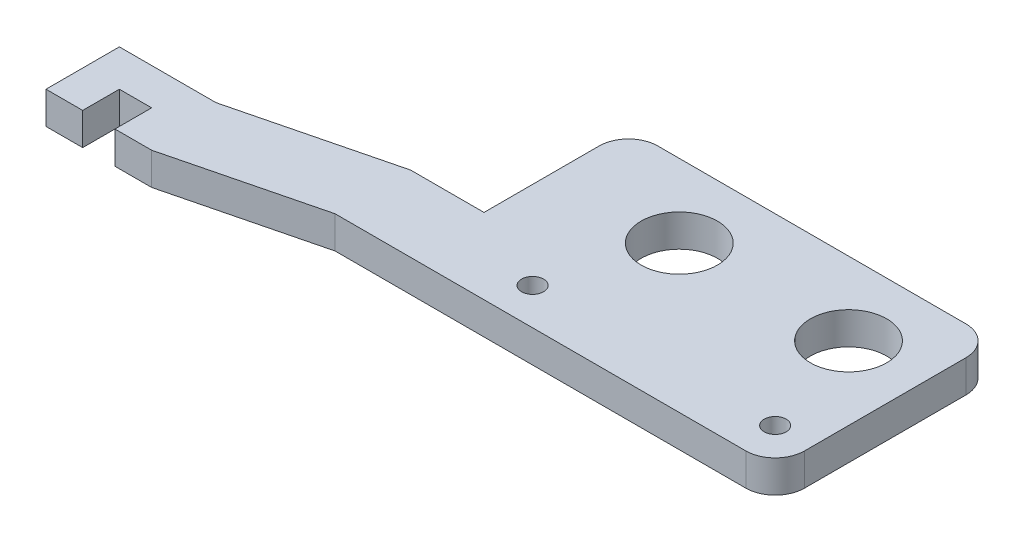
ISO-10303-21;
HEADER;
FILE_DESCRIPTION(('STEP AP214'),'2;1');
FILE_NAME('part.step','',(''),(''),'','','');
FILE_SCHEMA(('AUTOMOTIVE_DESIGN { 1 0 10303 214 1 1 1 1 }'));
ENDSEC;
DATA;
#1=APPLICATION_CONTEXT('core data for automotive mechanical design processes');
#2=APPLICATION_PROTOCOL_DEFINITION('international standard','automotive_design',2000,#1);
#3=PRODUCT_CONTEXT('',#1,'mechanical');
#4=PRODUCT('Part','Part','',(#3));
#5=PRODUCT_RELATED_PRODUCT_CATEGORY('part','',(#4));
#6=PRODUCT_DEFINITION_FORMATION('','',#4);
#7=PRODUCT_DEFINITION_CONTEXT('part definition',#1,'design');
#8=PRODUCT_DEFINITION('design','',#6,#7);
#9=PRODUCT_DEFINITION_SHAPE('','',#8);
#10=(LENGTH_UNIT() NAMED_UNIT(*) SI_UNIT(.MILLI.,.METRE.));
#11=(NAMED_UNIT(*) PLANE_ANGLE_UNIT() SI_UNIT($,.RADIAN.));
#12=(NAMED_UNIT(*) SI_UNIT($,.STERADIAN.) SOLID_ANGLE_UNIT());
#13=UNCERTAINTY_MEASURE_WITH_UNIT(LENGTH_MEASURE(1.E-05),#10,'distance_accuracy_value','');
#14=(GEOMETRIC_REPRESENTATION_CONTEXT(3) GLOBAL_UNCERTAINTY_ASSIGNED_CONTEXT((#13)) GLOBAL_UNIT_ASSIGNED_CONTEXT((#10,
#11,#12)) REPRESENTATION_CONTEXT('',''));
#15=CARTESIAN_POINT('',(0.,0.,0.));
#16=DIRECTION('',(0.,0.,1.));
#17=DIRECTION('',(1.,0.,0.));
#18=AXIS2_PLACEMENT_3D('',#15,#16,#17);
#19=CARTESIAN_POINT('',(59.944,2.794,-19.05));
#20=DIRECTION('',(-1.,0.,0.));
#21=DIRECTION('',(0.,0.,1.));
#22=AXIS2_PLACEMENT_3D('',#19,#20,#21);
#23=PLANE('',#22);
#24=DIRECTION('',(0.,0.,-1.));
#25=VECTOR('',#24,1.);
#26=CARTESIAN_POINT('',(59.944,0.,-19.05));
#27=LINE('',#26,#25);
#28=CARTESIAN_POINT('',(59.944,0.,-2.54000000000001));
#29=VERTEX_POINT('',#28);
#30=CARTESIAN_POINT('',(59.944,0.,-16.51));
#31=VERTEX_POINT('',#30);
#32=EDGE_CURVE('E238',#29,#31,#27,.T.);
#33=ORIENTED_EDGE('',*,*,#32,.T.);
#34=DIRECTION('',(0.,-1.,0.));
#35=VECTOR('',#34,1.);
#36=CARTESIAN_POINT('',(59.944,2.794,-16.51));
#37=LINE('',#36,#35);
#38=CARTESIAN_POINT('',(59.944,2.794,-16.51));
#39=VERTEX_POINT('',#38);
#40=EDGE_CURVE('E48',#31,#39,#37,.F.);
#41=ORIENTED_EDGE('',*,*,#40,.T.);
#42=DIRECTION('',(0.,0.,-1.));
#43=VECTOR('',#42,1.);
#44=CARTESIAN_POINT('',(59.944,2.794,-19.05));
#45=LINE('',#44,#43);
#46=CARTESIAN_POINT('',(59.944,2.794,-2.54000000000001));
#47=VERTEX_POINT('',#46);
#48=EDGE_CURVE('E268',#47,#39,#45,.T.);
#49=ORIENTED_EDGE('',*,*,#48,.F.);
#50=DIRECTION('',(0.,-1.,0.));
#51=VECTOR('',#50,1.);
#52=CARTESIAN_POINT('',(59.944,2.794,-2.54));
#53=LINE('',#52,#51);
#54=EDGE_CURVE('E315',#47,#29,#53,.T.);
#55=ORIENTED_EDGE('',*,*,#54,.T.);
#56=EDGE_LOOP('',(#33,#41,#49,#55));
#57=FACE_BOUND('',#56,.T.);
#58=ADVANCED_FACE('F39',(#57),#23,.F.);
#59=CARTESIAN_POINT('',(28.194,2.794,-19.05));
#60=DIRECTION('',(0.,0.,1.));
#61=DIRECTION('',(1.,0.,0.));
#62=AXIS2_PLACEMENT_3D('',#59,#60,#61);
#63=PLANE('',#62);
#64=DIRECTION('',(-1.,0.,0.));
#65=VECTOR('',#64,1.);
#66=CARTESIAN_POINT('',(28.194,0.,-19.05));
#67=LINE('',#66,#65);
#68=CARTESIAN_POINT('',(57.404,0.,-19.05));
#69=VERTEX_POINT('',#68);
#70=CARTESIAN_POINT('',(30.734,0.,-19.05));
#71=VERTEX_POINT('',#70);
#72=EDGE_CURVE('E240',#69,#71,#67,.T.);
#73=ORIENTED_EDGE('',*,*,#72,.T.);
#74=DIRECTION('',(0.,-1.,0.));
#75=VECTOR('',#74,1.);
#76=CARTESIAN_POINT('',(30.734,2.794,-19.05));
#77=LINE('',#76,#75);
#78=CARTESIAN_POINT('',(30.734,2.794,-19.05));
#79=VERTEX_POINT('',#78);
#80=EDGE_CURVE('E307',#71,#79,#77,.F.);
#81=ORIENTED_EDGE('',*,*,#80,.T.);
#82=DIRECTION('',(-1.,0.,0.));
#83=VECTOR('',#82,1.);
#84=CARTESIAN_POINT('',(28.194,2.794,-19.05));
#85=LINE('',#84,#83);
#86=CARTESIAN_POINT('',(57.404,2.794,-19.05));
#87=VERTEX_POINT('',#86);
#88=EDGE_CURVE('E174',#87,#79,#85,.T.);
#89=ORIENTED_EDGE('',*,*,#88,.F.);
#90=DIRECTION('',(0.,-1.,0.));
#91=VECTOR('',#90,1.);
#92=CARTESIAN_POINT('',(57.404,2.794,-19.05));
#93=LINE('',#92,#91);
#94=EDGE_CURVE('E304',#87,#69,#93,.T.);
#95=ORIENTED_EDGE('',*,*,#94,.T.);
#96=EDGE_LOOP('',(#73,#81,#89,#95));
#97=FACE_BOUND('',#96,.T.);
#98=ADVANCED_FACE('F333',(#97),#63,.F.);
#99=CARTESIAN_POINT('',(28.194,2.794,-6.54543018066803));
#100=DIRECTION('',(1.,0.,0.));
#101=DIRECTION('',(0.,0.,-1.));
#102=AXIS2_PLACEMENT_3D('',#99,#100,#101);
#103=PLANE('',#102);
#104=DIRECTION('',(0.,0.,1.));
#105=VECTOR('',#104,1.);
#106=CARTESIAN_POINT('',(28.194,2.794,-6.54543018066803));
#107=LINE('',#106,#105);
#108=CARTESIAN_POINT('',(28.194,2.794,-16.51));
#109=VERTEX_POINT('',#108);
#110=CARTESIAN_POINT('',(28.194,2.794,-6.54543018066803));
#111=VERTEX_POINT('',#110);
#112=EDGE_CURVE('E162',#109,#111,#107,.T.);
#113=ORIENTED_EDGE('',*,*,#112,.F.);
#114=DIRECTION('',(0.,-1.,0.));
#115=VECTOR('',#114,1.);
#116=CARTESIAN_POINT('',(28.194,2.794,-16.51));
#117=LINE('',#116,#115);
#118=CARTESIAN_POINT('',(28.194,0.,-16.51));
#119=VERTEX_POINT('',#118);
#120=EDGE_CURVE('E183',#109,#119,#117,.T.);
#121=ORIENTED_EDGE('',*,*,#120,.T.);
#122=DIRECTION('',(0.,0.,1.));
#123=VECTOR('',#122,1.);
#124=CARTESIAN_POINT('',(28.194,0.,-6.54543018066803));
#125=LINE('',#124,#123);
#126=CARTESIAN_POINT('',(28.194,0.,-6.54543018066803));
#127=VERTEX_POINT('',#126);
#128=EDGE_CURVE('E180',#119,#127,#125,.T.);
#129=ORIENTED_EDGE('',*,*,#128,.T.);
#130=DIRECTION('',(0.,-1.,0.));
#131=VECTOR('',#130,1.);
#132=CARTESIAN_POINT('',(28.194,2.794,-6.54543018066803));
#133=LINE('',#132,#131);
#134=EDGE_CURVE('E177',#111,#127,#133,.T.);
#135=ORIENTED_EDGE('',*,*,#134,.F.);
#136=EDGE_LOOP('',(#113,#121,#129,#135));
#137=FACE_BOUND('',#136,.T.);
#138=ADVANCED_FACE('F178',(#137),#103,.F.);
#139=CARTESIAN_POINT('',(21.844,2.794,-6.54543018066803));
#140=DIRECTION('',(0.,0.,1.));
#141=DIRECTION('',(1.,0.,0.));
#142=AXIS2_PLACEMENT_3D('',#139,#140,#141);
#143=PLANE('',#142);
#144=DIRECTION('',(-1.,0.,0.));
#145=VECTOR('',#144,1.);
#146=CARTESIAN_POINT('',(21.844,0.,-6.54543018066803));
#147=LINE('',#146,#145);
#148=CARTESIAN_POINT('',(21.844,0.,-6.54543018066803));
#149=VERTEX_POINT('',#148);
#150=EDGE_CURVE('E245',#127,#149,#147,.T.);
#151=ORIENTED_EDGE('',*,*,#150,.T.);
#152=DIRECTION('',(0.,-1.,0.));
#153=VECTOR('',#152,1.);
#154=CARTESIAN_POINT('',(21.844,2.794,-6.54543018066803));
#155=LINE('',#154,#153);
#156=CARTESIAN_POINT('',(21.844,2.794,-6.54543018066803));
#157=VERTEX_POINT('',#156);
#158=EDGE_CURVE('E184',#157,#149,#155,.T.);
#159=ORIENTED_EDGE('',*,*,#158,.F.);
#160=DIRECTION('',(-1.,0.,0.));
#161=VECTOR('',#160,1.);
#162=CARTESIAN_POINT('',(21.844,2.794,-6.54543018066803));
#163=LINE('',#162,#161);
#164=EDGE_CURVE('E167',#111,#157,#163,.T.);
#165=ORIENTED_EDGE('',*,*,#164,.F.);
#166=ORIENTED_EDGE('',*,*,#134,.T.);
#167=EDGE_LOOP('',(#151,#159,#165,#166));
#168=FACE_BOUND('',#167,.T.);
#169=ADVANCED_FACE('F186',(#168),#143,.F.);
#170=CARTESIAN_POINT('',(8.36227927732785,2.794,-3.175));
#171=DIRECTION('',(0.242535625036333,0.,0.970142500145332));
#172=DIRECTION('',(0.970142500145332,0.,-0.242535625036333));
#173=AXIS2_PLACEMENT_3D('',#170,#171,#172);
#174=PLANE('',#173);
#175=DIRECTION('',(-0.970142500145332,0.,0.242535625036333));
#176=VECTOR('',#175,1.);
#177=CARTESIAN_POINT('',(8.36227927732785,0.,-3.175));
#178=LINE('',#177,#176);
#179=CARTESIAN_POINT('',(8.36227927732785,0.,-3.175));
#180=VERTEX_POINT('',#179);
#181=EDGE_CURVE('E247',#149,#180,#178,.T.);
#182=ORIENTED_EDGE('',*,*,#181,.T.);
#183=DIRECTION('',(0.,-1.,0.));
#184=VECTOR('',#183,1.);
#185=CARTESIAN_POINT('',(8.36227927732785,2.794,-3.175));
#186=LINE('',#185,#184);
#187=CARTESIAN_POINT('',(8.36227927732785,2.794,-3.175));
#188=VERTEX_POINT('',#187);
#189=EDGE_CURVE('E292',#188,#180,#186,.T.);
#190=ORIENTED_EDGE('',*,*,#189,.F.);
#191=DIRECTION('',(-0.970142500145332,0.,0.242535625036333));
#192=VECTOR('',#191,1.);
#193=CARTESIAN_POINT('',(8.36227927732785,2.794,-3.175));
#194=LINE('',#193,#192);
#195=EDGE_CURVE('E189',#157,#188,#194,.T.);
#196=ORIENTED_EDGE('',*,*,#195,.F.);
#197=ORIENTED_EDGE('',*,*,#158,.T.);
#198=EDGE_LOOP('',(#182,#190,#196,#197));
#199=FACE_BOUND('',#198,.T.);
#200=ADVANCED_FACE('F463',(#199),#174,.F.);
#201=CARTESIAN_POINT('',(0.,2.794,-3.175));
#202=DIRECTION('',(0.,0.,1.));
#203=DIRECTION('',(1.,0.,0.));
#204=AXIS2_PLACEMENT_3D('',#201,#202,#203);
#205=PLANE('',#204);
#206=DIRECTION('',(-1.,0.,0.));
#207=VECTOR('',#206,1.);
#208=CARTESIAN_POINT('',(0.,0.,-3.175));
#209=LINE('',#208,#207);
#210=CARTESIAN_POINT('',(0.,0.,-3.175));
#211=VERTEX_POINT('',#210);
#212=EDGE_CURVE('E249',#180,#211,#209,.T.);
#213=ORIENTED_EDGE('',*,*,#212,.T.);
#214=DIRECTION('',(0.,-1.,0.));
#215=VECTOR('',#214,1.);
#216=CARTESIAN_POINT('',(0.,2.794,-3.175));
#217=LINE('',#216,#215);
#218=CARTESIAN_POINT('',(0.,2.794,-3.175));
#219=VERTEX_POINT('',#218);
#220=EDGE_CURVE('E289',#219,#211,#217,.T.);
#221=ORIENTED_EDGE('',*,*,#220,.F.);
#222=DIRECTION('',(-1.,0.,0.));
#223=VECTOR('',#222,1.);
#224=CARTESIAN_POINT('',(0.,2.794,-3.175));
#225=LINE('',#224,#223);
#226=EDGE_CURVE('E191',#188,#219,#225,.T.);
#227=ORIENTED_EDGE('',*,*,#226,.F.);
#228=ORIENTED_EDGE('',*,*,#189,.T.);
#229=EDGE_LOOP('',(#213,#221,#227,#228));
#230=FACE_BOUND('',#229,.T.);
#231=ADVANCED_FACE('F460',(#230),#205,.F.);
#232=CARTESIAN_POINT('',(0.,2.794,3.175));
#233=DIRECTION('',(1.,0.,0.));
#234=DIRECTION('',(0.,0.,-1.));
#235=AXIS2_PLACEMENT_3D('',#232,#233,#234);
#236=PLANE('',#235);
#237=DIRECTION('',(0.,0.,1.));
#238=VECTOR('',#237,1.);
#239=CARTESIAN_POINT('',(0.,0.,3.175));
#240=LINE('',#239,#238);
#241=CARTESIAN_POINT('',(0.,0.,3.175));
#242=VERTEX_POINT('',#241);
#243=EDGE_CURVE('E251',#211,#242,#240,.T.);
#244=ORIENTED_EDGE('',*,*,#243,.T.);
#245=DIRECTION('',(0.,-1.,0.));
#246=VECTOR('',#245,1.);
#247=CARTESIAN_POINT('',(0.,2.794,3.175));
#248=LINE('',#247,#246);
#249=CARTESIAN_POINT('',(0.,2.794,3.175));
#250=VERTEX_POINT('',#249);
#251=EDGE_CURVE('E286',#250,#242,#248,.T.);
#252=ORIENTED_EDGE('',*,*,#251,.F.);
#253=DIRECTION('',(0.,0.,1.));
#254=VECTOR('',#253,1.);
#255=CARTESIAN_POINT('',(0.,2.794,3.175));
#256=LINE('',#255,#254);
#257=EDGE_CURVE('E207',#219,#250,#256,.T.);
#258=ORIENTED_EDGE('',*,*,#257,.F.);
#259=ORIENTED_EDGE('',*,*,#220,.T.);
#260=EDGE_LOOP('',(#244,#252,#258,#259));
#261=FACE_BOUND('',#260,.T.);
#262=ADVANCED_FACE('F455',(#261),#236,.F.);
#263=CARTESIAN_POINT('',(3.175,2.794,3.175));
#264=DIRECTION('',(0.,0.,-1.));
#265=DIRECTION('',(-1.,0.,0.));
#266=AXIS2_PLACEMENT_3D('',#263,#264,#265);
#267=PLANE('',#266);
#268=DIRECTION('',(1.,0.,0.));
#269=VECTOR('',#268,1.);
#270=CARTESIAN_POINT('',(3.175,0.,3.175));
#271=LINE('',#270,#269);
#272=CARTESIAN_POINT('',(3.175,0.,3.175));
#273=VERTEX_POINT('',#272);
#274=EDGE_CURVE('E253',#242,#273,#271,.T.);
#275=ORIENTED_EDGE('',*,*,#274,.T.);
#276=DIRECTION('',(0.,-1.,0.));
#277=VECTOR('',#276,1.);
#278=CARTESIAN_POINT('',(3.175,2.794,3.175));
#279=LINE('',#278,#277);
#280=CARTESIAN_POINT('',(3.175,2.794,3.175));
#281=VERTEX_POINT('',#280);
#282=EDGE_CURVE('E283',#281,#273,#279,.T.);
#283=ORIENTED_EDGE('',*,*,#282,.F.);
#284=DIRECTION('',(1.,0.,0.));
#285=VECTOR('',#284,1.);
#286=CARTESIAN_POINT('',(3.175,2.794,3.175));
#287=LINE('',#286,#285);
#288=EDGE_CURVE('E210',#250,#281,#287,.T.);
#289=ORIENTED_EDGE('',*,*,#288,.F.);
#290=ORIENTED_EDGE('',*,*,#251,.T.);
#291=EDGE_LOOP('',(#275,#283,#289,#290));
#292=FACE_BOUND('',#291,.T.);
#293=ADVANCED_FACE('F449',(#292),#267,.F.);
#294=CARTESIAN_POINT('',(3.175,2.794,0.));
#295=DIRECTION('',(-1.,0.,0.));
#296=DIRECTION('',(0.,0.,1.));
#297=AXIS2_PLACEMENT_3D('',#294,#295,#296);
#298=PLANE('',#297);
#299=DIRECTION('',(0.,0.,-1.));
#300=VECTOR('',#299,1.);
#301=CARTESIAN_POINT('',(3.175,0.,0.));
#302=LINE('',#301,#300);
#303=CARTESIAN_POINT('',(3.175,0.,0.));
#304=VERTEX_POINT('',#303);
#305=EDGE_CURVE('E255',#273,#304,#302,.T.);
#306=ORIENTED_EDGE('',*,*,#305,.T.);
#307=DIRECTION('',(0.,-1.,0.));
#308=VECTOR('',#307,1.);
#309=CARTESIAN_POINT('',(3.175,2.794,0.));
#310=LINE('',#309,#308);
#311=CARTESIAN_POINT('',(3.175,2.794,0.));
#312=VERTEX_POINT('',#311);
#313=EDGE_CURVE('E280',#312,#304,#310,.T.);
#314=ORIENTED_EDGE('',*,*,#313,.F.);
#315=DIRECTION('',(0.,0.,-1.));
#316=VECTOR('',#315,1.);
#317=CARTESIAN_POINT('',(3.175,2.794,0.));
#318=LINE('',#317,#316);
#319=EDGE_CURVE('E213',#281,#312,#318,.T.);
#320=ORIENTED_EDGE('',*,*,#319,.F.);
#321=ORIENTED_EDGE('',*,*,#282,.T.);
#322=EDGE_LOOP('',(#306,#314,#320,#321));
#323=FACE_BOUND('',#322,.T.);
#324=ADVANCED_FACE('F445',(#323),#298,.F.);
#325=CARTESIAN_POINT('',(5.969,2.794,0.));
#326=DIRECTION('',(0.,0.,-1.));
#327=DIRECTION('',(-1.,0.,0.));
#328=AXIS2_PLACEMENT_3D('',#325,#326,#327);
#329=PLANE('',#328);
#330=DIRECTION('',(1.,0.,0.));
#331=VECTOR('',#330,1.);
#332=CARTESIAN_POINT('',(5.969,0.,0.));
#333=LINE('',#332,#331);
#334=CARTESIAN_POINT('',(5.969,0.,0.));
#335=VERTEX_POINT('',#334);
#336=EDGE_CURVE('E257',#304,#335,#333,.T.);
#337=ORIENTED_EDGE('',*,*,#336,.T.);
#338=DIRECTION('',(0.,-1.,0.));
#339=VECTOR('',#338,1.);
#340=CARTESIAN_POINT('',(5.969,2.794,0.));
#341=LINE('',#340,#339);
#342=CARTESIAN_POINT('',(5.969,2.794,0.));
#343=VERTEX_POINT('',#342);
#344=EDGE_CURVE('E277',#343,#335,#341,.T.);
#345=ORIENTED_EDGE('',*,*,#344,.F.);
#346=DIRECTION('',(1.,0.,0.));
#347=VECTOR('',#346,1.);
#348=CARTESIAN_POINT('',(5.969,2.794,0.));
#349=LINE('',#348,#347);
#350=EDGE_CURVE('E221',#312,#343,#349,.T.);
#351=ORIENTED_EDGE('',*,*,#350,.F.);
#352=ORIENTED_EDGE('',*,*,#313,.T.);
#353=EDGE_LOOP('',(#337,#345,#351,#352));
#354=FACE_BOUND('',#353,.T.);
#355=ADVANCED_FACE('F440',(#354),#329,.F.);
#356=CARTESIAN_POINT('',(5.969,2.794,3.175));
#357=DIRECTION('',(1.,0.,0.));
#358=DIRECTION('',(0.,0.,-1.));
#359=AXIS2_PLACEMENT_3D('',#356,#357,#358);
#360=PLANE('',#359);
#361=DIRECTION('',(0.,0.,1.));
#362=VECTOR('',#361,1.);
#363=CARTESIAN_POINT('',(5.969,0.,3.175));
#364=LINE('',#363,#362);
#365=CARTESIAN_POINT('',(5.969,0.,3.175));
#366=VERTEX_POINT('',#365);
#367=EDGE_CURVE('E259',#335,#366,#364,.T.);
#368=ORIENTED_EDGE('',*,*,#367,.T.);
#369=DIRECTION('',(0.,-1.,0.));
#370=VECTOR('',#369,1.);
#371=CARTESIAN_POINT('',(5.969,2.794,3.175));
#372=LINE('',#371,#370);
#373=CARTESIAN_POINT('',(5.969,2.794,3.175));
#374=VERTEX_POINT('',#373);
#375=EDGE_CURVE('E274',#374,#366,#372,.T.);
#376=ORIENTED_EDGE('',*,*,#375,.F.);
#377=DIRECTION('',(0.,0.,1.));
#378=VECTOR('',#377,1.);
#379=CARTESIAN_POINT('',(5.969,2.794,3.175));
#380=LINE('',#379,#378);
#381=EDGE_CURVE('E223',#343,#374,#380,.T.);
#382=ORIENTED_EDGE('',*,*,#381,.F.);
#383=ORIENTED_EDGE('',*,*,#344,.T.);
#384=EDGE_LOOP('',(#368,#376,#382,#383));
#385=FACE_BOUND('',#384,.T.);
#386=ADVANCED_FACE('F434',(#385),#360,.F.);
#387=CARTESIAN_POINT('',(9.144,2.794,3.175));
#388=DIRECTION('',(0.,0.,-1.));
#389=DIRECTION('',(-1.,0.,0.));
#390=AXIS2_PLACEMENT_3D('',#387,#388,#389);
#391=PLANE('',#390);
#392=DIRECTION('',(1.,0.,0.));
#393=VECTOR('',#392,1.);
#394=CARTESIAN_POINT('',(9.144,0.,3.175));
#395=LINE('',#394,#393);
#396=CARTESIAN_POINT('',(9.144,0.,3.175));
#397=VERTEX_POINT('',#396);
#398=EDGE_CURVE('E261',#366,#397,#395,.T.);
#399=ORIENTED_EDGE('',*,*,#398,.T.);
#400=DIRECTION('',(0.,-1.,0.));
#401=VECTOR('',#400,1.);
#402=CARTESIAN_POINT('',(9.144,2.794,3.175));
#403=LINE('',#402,#401);
#404=CARTESIAN_POINT('',(9.144,2.794,3.175));
#405=VERTEX_POINT('',#404);
#406=EDGE_CURVE('E271',#405,#397,#403,.T.);
#407=ORIENTED_EDGE('',*,*,#406,.F.);
#408=DIRECTION('',(1.,0.,0.));
#409=VECTOR('',#408,1.);
#410=CARTESIAN_POINT('',(9.144,2.794,3.175));
#411=LINE('',#410,#409);
#412=EDGE_CURVE('E226',#374,#405,#411,.T.);
#413=ORIENTED_EDGE('',*,*,#412,.F.);
#414=ORIENTED_EDGE('',*,*,#375,.T.);
#415=EDGE_LOOP('',(#399,#407,#413,#414));
#416=FACE_BOUND('',#415,.T.);
#417=ADVANCED_FACE('F430',(#416),#391,.F.);
#418=CARTESIAN_POINT('',(21.844,2.794,0.));
#419=DIRECTION('',(-0.242535625036333,0.,-0.970142500145332));
#420=DIRECTION('',(-0.970142500145332,0.,0.242535625036333));
#421=AXIS2_PLACEMENT_3D('',#418,#419,#420);
#422=PLANE('',#421);
#423=DIRECTION('',(0.970142500145332,0.,-0.242535625036333));
#424=VECTOR('',#423,1.);
#425=CARTESIAN_POINT('',(21.844,0.,0.));
#426=LINE('',#425,#424);
#427=CARTESIAN_POINT('',(21.844,0.,0.));
#428=VERTEX_POINT('',#427);
#429=EDGE_CURVE('E263',#397,#428,#426,.T.);
#430=ORIENTED_EDGE('',*,*,#429,.T.);
#431=DIRECTION('',(0.,-1.,0.));
#432=VECTOR('',#431,1.);
#433=CARTESIAN_POINT('',(21.844,2.794,0.));
#434=LINE('',#433,#432);
#435=CARTESIAN_POINT('',(21.844,2.794,0.));
#436=VERTEX_POINT('',#435);
#437=EDGE_CURVE('E237',#436,#428,#434,.T.);
#438=ORIENTED_EDGE('',*,*,#437,.F.);
#439=DIRECTION('',(0.970142500145332,0.,-0.242535625036333));
#440=VECTOR('',#439,1.);
#441=CARTESIAN_POINT('',(21.844,2.794,0.));
#442=LINE('',#441,#440);
#443=EDGE_CURVE('E229',#405,#436,#442,.T.);
#444=ORIENTED_EDGE('',*,*,#443,.F.);
#445=ORIENTED_EDGE('',*,*,#406,.T.);
#446=EDGE_LOOP('',(#430,#438,#444,#445));
#447=FACE_BOUND('',#446,.T.);
#448=ADVANCED_FACE('F426',(#447),#422,.F.);
#449=CARTESIAN_POINT('',(59.944,2.794,0.));
#450=DIRECTION('',(0.,0.,-1.));
#451=DIRECTION('',(-1.,0.,0.));
#452=AXIS2_PLACEMENT_3D('',#449,#450,#451);
#453=PLANE('',#452);
#454=DIRECTION('',(1.,0.,0.));
#455=VECTOR('',#454,1.);
#456=CARTESIAN_POINT('',(59.944,0.,0.));
#457=LINE('',#456,#455);
#458=CARTESIAN_POINT('',(57.404,0.,0.));
#459=VERTEX_POINT('',#458);
#460=EDGE_CURVE('E265',#428,#459,#457,.T.);
#461=ORIENTED_EDGE('',*,*,#460,.T.);
#462=DIRECTION('',(0.,-1.,0.));
#463=VECTOR('',#462,1.);
#464=CARTESIAN_POINT('',(57.404,2.794,0.));
#465=LINE('',#464,#463);
#466=CARTESIAN_POINT('',(57.404,2.794,0.));
#467=VERTEX_POINT('',#466);
#468=EDGE_CURVE('E12',#459,#467,#465,.F.);
#469=ORIENTED_EDGE('',*,*,#468,.T.);
#470=DIRECTION('',(1.,0.,0.));
#471=VECTOR('',#470,1.);
#472=CARTESIAN_POINT('',(59.944,2.794,0.));
#473=LINE('',#472,#471);
#474=EDGE_CURVE('E233',#436,#467,#473,.T.);
#475=ORIENTED_EDGE('',*,*,#474,.F.);
#476=ORIENTED_EDGE('',*,*,#437,.T.);
#477=EDGE_LOOP('',(#461,#469,#475,#476));
#478=FACE_BOUND('',#477,.T.);
#479=ADVANCED_FACE('F383',(#478),#453,.F.);
#480=CARTESIAN_POINT('',(0.,2.794,0.));
#481=DIRECTION('',(0.,-1.,0.));
#482=DIRECTION('',(0.,0.,-1.));
#483=AXIS2_PLACEMENT_3D('',#480,#481,#482);
#484=PLANE('',#483);
#485=CARTESIAN_POINT('',(38.944,2.794,-12.7));
#486=DIRECTION('',(0.,1.,0.));
#487=DIRECTION('',(0.,0.,1.));
#488=AXIS2_PLACEMENT_3D('',#485,#486,#487);
#489=CIRCLE('',#488,3.302);
#490=CARTESIAN_POINT('',(38.944,2.794,-9.398));
#491=VERTEX_POINT('',#490);
#492=EDGE_CURVE('E364',#491,#491,#489,.T.);
#493=ORIENTED_EDGE('',*,*,#492,.F.);
#494=EDGE_LOOP('',(#493));
#495=FACE_BOUND('',#494,.T.);
#496=CARTESIAN_POINT('',(53.594,2.794,-12.7));
#497=DIRECTION('',(0.,1.,0.));
#498=DIRECTION('',(0.,0.,1.));
#499=AXIS2_PLACEMENT_3D('',#496,#497,#498);
#500=CIRCLE('',#499,3.302);
#501=CARTESIAN_POINT('',(53.594,2.794,-9.39800000000001));
#502=VERTEX_POINT('',#501);
#503=EDGE_CURVE('E357',#502,#502,#500,.T.);
#504=ORIENTED_EDGE('',*,*,#503,.F.);
#505=EDGE_LOOP('',(#504));
#506=FACE_BOUND('',#505,.T.);
#507=CARTESIAN_POINT('',(35.769,2.794,-3.17499999999999));
#508=DIRECTION('',(0.,1.,0.));
#509=DIRECTION('',(0.,0.,1.));
#510=AXIS2_PLACEMENT_3D('',#507,#508,#509);
#511=CIRCLE('',#510,0.952500000000004);
#512=CARTESIAN_POINT('',(35.769,2.794,-2.22249999999999));
#513=VERTEX_POINT('',#512);
#514=EDGE_CURVE('E350',#513,#513,#511,.T.);
#515=ORIENTED_EDGE('',*,*,#514,.F.);
#516=EDGE_LOOP('',(#515));
#517=FACE_BOUND('',#516,.T.);
#518=CARTESIAN_POINT('',(56.769,2.794,-3.17499999999999));
#519=DIRECTION('',(0.,1.,0.));
#520=DIRECTION('',(0.,0.,1.));
#521=AXIS2_PLACEMENT_3D('',#518,#519,#520);
#522=CIRCLE('',#521,0.952500000000004);
#523=CARTESIAN_POINT('',(56.769,2.794,-2.22249999999999));
#524=VERTEX_POINT('',#523);
#525=EDGE_CURVE('E342',#524,#524,#522,.T.);
#526=ORIENTED_EDGE('',*,*,#525,.F.);
#527=EDGE_LOOP('',(#526));
#528=FACE_BOUND('',#527,.T.);
#529=ORIENTED_EDGE('',*,*,#88,.T.);
#530=CARTESIAN_POINT('',(30.734,2.794,-16.51));
#531=DIRECTION('',(0.,-1.,0.));
#532=DIRECTION('',(0.,0.,-1.));
#533=AXIS2_PLACEMENT_3D('',#530,#531,#532);
#534=CIRCLE('',#533,2.54);
#535=EDGE_CURVE('E170',#79,#109,#534,.F.);
#536=ORIENTED_EDGE('',*,*,#535,.T.);
#537=ORIENTED_EDGE('',*,*,#112,.T.);
#538=ORIENTED_EDGE('',*,*,#164,.T.);
#539=ORIENTED_EDGE('',*,*,#195,.T.);
#540=ORIENTED_EDGE('',*,*,#226,.T.);
#541=ORIENTED_EDGE('',*,*,#257,.T.);
#542=ORIENTED_EDGE('',*,*,#288,.T.);
#543=ORIENTED_EDGE('',*,*,#319,.T.);
#544=ORIENTED_EDGE('',*,*,#350,.T.);
#545=ORIENTED_EDGE('',*,*,#381,.T.);
#546=ORIENTED_EDGE('',*,*,#412,.T.);
#547=ORIENTED_EDGE('',*,*,#443,.T.);
#548=ORIENTED_EDGE('',*,*,#474,.T.);
#549=CARTESIAN_POINT('',(57.404,2.794,-2.54));
#550=DIRECTION('',(0.,-1.,0.));
#551=DIRECTION('',(0.,0.,-1.));
#552=AXIS2_PLACEMENT_3D('',#549,#550,#551);
#553=CIRCLE('',#552,2.54);
#554=EDGE_CURVE('E309',#467,#47,#553,.F.);
#555=ORIENTED_EDGE('',*,*,#554,.T.);
#556=ORIENTED_EDGE('',*,*,#48,.T.);
#557=CARTESIAN_POINT('',(57.404,2.794,-16.51));
#558=DIRECTION('',(0.,-1.,0.));
#559=DIRECTION('',(0.,0.,-1.));
#560=AXIS2_PLACEMENT_3D('',#557,#558,#559);
#561=CIRCLE('',#560,2.54);
#562=EDGE_CURVE('E312',#39,#87,#561,.F.);
#563=ORIENTED_EDGE('',*,*,#562,.T.);
#564=EDGE_LOOP('',(#529,#536,#537,#538,#539,#540,#541,#542,#543,#544,#545,#546,#547,#548,#555,
#556,#563));
#565=FACE_BOUND('',#564,.T.);
#566=ADVANCED_FACE('F165',(#495,#506,#517,#528,#565),#484,.F.);
#567=CARTESIAN_POINT('',(0.,0.,0.));
#568=DIRECTION('',(0.,-1.,0.));
#569=DIRECTION('',(0.,0.,-1.));
#570=AXIS2_PLACEMENT_3D('',#567,#568,#569);
#571=PLANE('',#570);
#572=CARTESIAN_POINT('',(38.944,0.,-12.7));
#573=DIRECTION('',(0.,1.,0.));
#574=DIRECTION('',(0.,0.,1.));
#575=AXIS2_PLACEMENT_3D('',#572,#573,#574);
#576=CIRCLE('',#575,3.302);
#577=CARTESIAN_POINT('',(38.944,0.,-9.398));
#578=VERTEX_POINT('',#577);
#579=EDGE_CURVE('E361',#578,#578,#576,.T.);
#580=ORIENTED_EDGE('',*,*,#579,.T.);
#581=EDGE_LOOP('',(#580));
#582=FACE_BOUND('',#581,.T.);
#583=CARTESIAN_POINT('',(53.594,0.,-12.7));
#584=DIRECTION('',(0.,1.,0.));
#585=DIRECTION('',(0.,0.,1.));
#586=AXIS2_PLACEMENT_3D('',#583,#584,#585);
#587=CIRCLE('',#586,3.302);
#588=CARTESIAN_POINT('',(53.594,0.,-9.39800000000001));
#589=VERTEX_POINT('',#588);
#590=EDGE_CURVE('E354',#589,#589,#587,.T.);
#591=ORIENTED_EDGE('',*,*,#590,.T.);
#592=EDGE_LOOP('',(#591));
#593=FACE_BOUND('',#592,.T.);
#594=CARTESIAN_POINT('',(35.769,0.,-3.17499999999999));
#595=DIRECTION('',(0.,1.,0.));
#596=DIRECTION('',(0.,0.,1.));
#597=AXIS2_PLACEMENT_3D('',#594,#595,#596);
#598=CIRCLE('',#597,0.952500000000004);
#599=CARTESIAN_POINT('',(35.769,0.,-2.22249999999999));
#600=VERTEX_POINT('',#599);
#601=EDGE_CURVE('E347',#600,#600,#598,.T.);
#602=ORIENTED_EDGE('',*,*,#601,.T.);
#603=EDGE_LOOP('',(#602));
#604=FACE_BOUND('',#603,.T.);
#605=CARTESIAN_POINT('',(56.769,0.,-3.17499999999999));
#606=DIRECTION('',(0.,1.,0.));
#607=DIRECTION('',(0.,0.,1.));
#608=AXIS2_PLACEMENT_3D('',#605,#606,#607);
#609=CIRCLE('',#608,0.952500000000004);
#610=CARTESIAN_POINT('',(56.769,0.,-2.22249999999999));
#611=VERTEX_POINT('',#610);
#612=EDGE_CURVE('E241',#611,#611,#609,.T.);
#613=ORIENTED_EDGE('',*,*,#612,.T.);
#614=EDGE_LOOP('',(#613));
#615=FACE_BOUND('',#614,.T.);
#616=ORIENTED_EDGE('',*,*,#128,.F.);
#617=CARTESIAN_POINT('',(30.734,0.,-16.51));
#618=DIRECTION('',(0.,-1.,0.));
#619=DIRECTION('',(0.,0.,-1.));
#620=AXIS2_PLACEMENT_3D('',#617,#618,#619);
#621=CIRCLE('',#620,2.54);
#622=EDGE_CURVE('E302',#119,#71,#621,.T.);
#623=ORIENTED_EDGE('',*,*,#622,.T.);
#624=ORIENTED_EDGE('',*,*,#72,.F.);
#625=CARTESIAN_POINT('',(57.404,0.,-16.51));
#626=DIRECTION('',(0.,-1.,0.));
#627=DIRECTION('',(0.,0.,-1.));
#628=AXIS2_PLACEMENT_3D('',#625,#626,#627);
#629=CIRCLE('',#628,2.54);
#630=EDGE_CURVE('E300',#69,#31,#629,.T.);
#631=ORIENTED_EDGE('',*,*,#630,.T.);
#632=ORIENTED_EDGE('',*,*,#32,.F.);
#633=CARTESIAN_POINT('',(57.404,0.,-2.54));
#634=DIRECTION('',(0.,-1.,0.));
#635=DIRECTION('',(0.,0.,-1.));
#636=AXIS2_PLACEMENT_3D('',#633,#634,#635);
#637=CIRCLE('',#636,2.54);
#638=EDGE_CURVE('E297',#29,#459,#637,.T.);
#639=ORIENTED_EDGE('',*,*,#638,.T.);
#640=ORIENTED_EDGE('',*,*,#460,.F.);
#641=ORIENTED_EDGE('',*,*,#429,.F.);
#642=ORIENTED_EDGE('',*,*,#398,.F.);
#643=ORIENTED_EDGE('',*,*,#367,.F.);
#644=ORIENTED_EDGE('',*,*,#336,.F.);
#645=ORIENTED_EDGE('',*,*,#305,.F.);
#646=ORIENTED_EDGE('',*,*,#274,.F.);
#647=ORIENTED_EDGE('',*,*,#243,.F.);
#648=ORIENTED_EDGE('',*,*,#212,.F.);
#649=ORIENTED_EDGE('',*,*,#181,.F.);
#650=ORIENTED_EDGE('',*,*,#150,.F.);
#651=EDGE_LOOP('',(#616,#623,#624,#631,#632,#639,#640,#641,#642,#643,#644,#645,#646,#647,#648,
#649,#650));
#652=FACE_BOUND('',#651,.T.);
#653=ADVANCED_FACE('F324',(#582,#593,#604,#615,#652),#571,.T.);
#654=CARTESIAN_POINT('',(56.769,0.,-3.17499999999999));
#655=DIRECTION('',(0.,1.,0.));
#656=DIRECTION('',(0.,0.,1.));
#657=AXIS2_PLACEMENT_3D('',#654,#655,#656);
#658=CYLINDRICAL_SURFACE('',#657,0.952500000000004);
#659=ORIENTED_EDGE('',*,*,#612,.F.);
#660=EDGE_LOOP('',(#659));
#661=FACE_BOUND('',#660,.T.);
#662=ORIENTED_EDGE('',*,*,#525,.T.);
#663=EDGE_LOOP('',(#662));
#664=FACE_BOUND('',#663,.T.);
#665=ADVANCED_FACE('F391',(#661,#664),#658,.F.);
#666=CARTESIAN_POINT('',(35.769,0.,-3.17499999999999));
#667=DIRECTION('',(0.,1.,0.));
#668=DIRECTION('',(0.,0.,1.));
#669=AXIS2_PLACEMENT_3D('',#666,#667,#668);
#670=CYLINDRICAL_SURFACE('',#669,0.952500000000004);
#671=ORIENTED_EDGE('',*,*,#601,.F.);
#672=EDGE_LOOP('',(#671));
#673=FACE_BOUND('',#672,.T.);
#674=ORIENTED_EDGE('',*,*,#514,.T.);
#675=EDGE_LOOP('',(#674));
#676=FACE_BOUND('',#675,.T.);
#677=ADVANCED_FACE('F393',(#673,#676),#670,.F.);
#678=CARTESIAN_POINT('',(53.594,0.,-12.7));
#679=DIRECTION('',(0.,1.,0.));
#680=DIRECTION('',(0.,0.,1.));
#681=AXIS2_PLACEMENT_3D('',#678,#679,#680);
#682=CYLINDRICAL_SURFACE('',#681,3.302);
#683=ORIENTED_EDGE('',*,*,#590,.F.);
#684=EDGE_LOOP('',(#683));
#685=FACE_BOUND('',#684,.T.);
#686=ORIENTED_EDGE('',*,*,#503,.T.);
#687=EDGE_LOOP('',(#686));
#688=FACE_BOUND('',#687,.T.);
#689=ADVANCED_FACE('F377',(#685,#688),#682,.F.);
#690=CARTESIAN_POINT('',(38.944,0.,-12.7));
#691=DIRECTION('',(0.,1.,0.));
#692=DIRECTION('',(0.,0.,1.));
#693=AXIS2_PLACEMENT_3D('',#690,#691,#692);
#694=CYLINDRICAL_SURFACE('',#693,3.302);
#695=ORIENTED_EDGE('',*,*,#579,.F.);
#696=EDGE_LOOP('',(#695));
#697=FACE_BOUND('',#696,.T.);
#698=ORIENTED_EDGE('',*,*,#492,.T.);
#699=EDGE_LOOP('',(#698));
#700=FACE_BOUND('',#699,.T.);
#701=ADVANCED_FACE('F373',(#697,#700),#694,.F.);
#702=CARTESIAN_POINT('',(30.734,2.794,-16.51));
#703=DIRECTION('',(0.,-1.,0.));
#704=DIRECTION('',(0.,0.,-1.));
#705=AXIS2_PLACEMENT_3D('',#702,#703,#704);
#706=CYLINDRICAL_SURFACE('',#705,2.54);
#707=ORIENTED_EDGE('',*,*,#535,.F.);
#708=ORIENTED_EDGE('',*,*,#80,.F.);
#709=ORIENTED_EDGE('',*,*,#622,.F.);
#710=ORIENTED_EDGE('',*,*,#120,.F.);
#711=EDGE_LOOP('',(#707,#708,#709,#710));
#712=FACE_BOUND('',#711,.T.);
#713=ADVANCED_FACE('F376',(#712),#706,.T.);
#714=CARTESIAN_POINT('',(57.404,2.794,-16.51));
#715=DIRECTION('',(0.,-1.,0.));
#716=DIRECTION('',(0.,0.,-1.));
#717=AXIS2_PLACEMENT_3D('',#714,#715,#716);
#718=CYLINDRICAL_SURFACE('',#717,2.54);
#719=ORIENTED_EDGE('',*,*,#562,.F.);
#720=ORIENTED_EDGE('',*,*,#40,.F.);
#721=ORIENTED_EDGE('',*,*,#630,.F.);
#722=ORIENTED_EDGE('',*,*,#94,.F.);
#723=EDGE_LOOP('',(#719,#720,#721,#722));
#724=FACE_BOUND('',#723,.T.);
#725=ADVANCED_FACE('F330',(#724),#718,.T.);
#726=CARTESIAN_POINT('',(57.404,2.794,-2.54));
#727=DIRECTION('',(0.,-1.,0.));
#728=DIRECTION('',(0.,0.,-1.));
#729=AXIS2_PLACEMENT_3D('',#726,#727,#728);
#730=CYLINDRICAL_SURFACE('',#729,2.54);
#731=ORIENTED_EDGE('',*,*,#554,.F.);
#732=ORIENTED_EDGE('',*,*,#468,.F.);
#733=ORIENTED_EDGE('',*,*,#638,.F.);
#734=ORIENTED_EDGE('',*,*,#54,.F.);
#735=EDGE_LOOP('',(#731,#732,#733,#734));
#736=FACE_BOUND('',#735,.T.);
#737=ADVANCED_FACE('F41',(#736),#730,.T.);
#738=CLOSED_SHELL('',(#58,#98,#138,#169,#200,#231,#262,#293,#324,#355,#386,#417,#448,#479,#566,
#653,#665,#677,#689,#701,#713,#725,#737));
#739=MANIFOLD_SOLID_BREP('B2',#738);
#740=ADVANCED_BREP_SHAPE_REPRESENTATION('',(#18,#739),#14);
#741=SHAPE_DEFINITION_REPRESENTATION(#9,#740);
ENDSEC;
END-ISO-10303-21;
